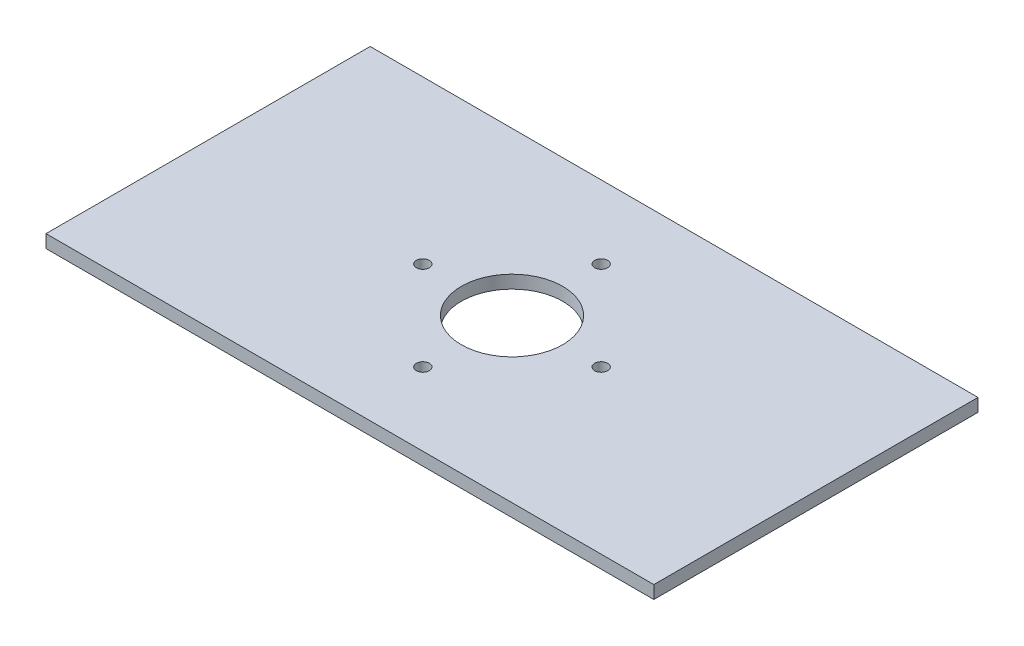
ISO-10303-21;
HEADER;
FILE_DESCRIPTION(('STEP AP214'),'2;1');
FILE_NAME('part.step','',(''),(''),'','','');
FILE_SCHEMA(('AUTOMOTIVE_DESIGN { 1 0 10303 214 1 1 1 1 }'));
ENDSEC;
DATA;
#1=APPLICATION_CONTEXT('core data for automotive mechanical design processes');
#2=APPLICATION_PROTOCOL_DEFINITION('international standard','automotive_design',2000,#1);
#3=PRODUCT_CONTEXT('',#1,'mechanical');
#4=PRODUCT('Part','Part','',(#3));
#5=PRODUCT_RELATED_PRODUCT_CATEGORY('part','',(#4));
#6=PRODUCT_DEFINITION_FORMATION('','',#4);
#7=PRODUCT_DEFINITION_CONTEXT('part definition',#1,'design');
#8=PRODUCT_DEFINITION('design','',#6,#7);
#9=PRODUCT_DEFINITION_SHAPE('','',#8);
#10=(LENGTH_UNIT() NAMED_UNIT(*) SI_UNIT(.MILLI.,.METRE.));
#11=(NAMED_UNIT(*) PLANE_ANGLE_UNIT() SI_UNIT($,.RADIAN.));
#12=(NAMED_UNIT(*) SI_UNIT($,.STERADIAN.) SOLID_ANGLE_UNIT());
#13=UNCERTAINTY_MEASURE_WITH_UNIT(LENGTH_MEASURE(1.E-05),#10,'distance_accuracy_value','');
#14=(GEOMETRIC_REPRESENTATION_CONTEXT(3) GLOBAL_UNCERTAINTY_ASSIGNED_CONTEXT((#13)) GLOBAL_UNIT_ASSIGNED_CONTEXT((#10,
#11,#12)) REPRESENTATION_CONTEXT('',''));
#15=CARTESIAN_POINT('',(0.,0.,0.));
#16=DIRECTION('',(0.,0.,1.));
#17=DIRECTION('',(1.,0.,0.));
#18=AXIS2_PLACEMENT_3D('',#15,#16,#17);
#19=CARTESIAN_POINT('',(-75.,3.2,-40.));
#20=DIRECTION('',(1.,0.,0.));
#21=DIRECTION('',(0.,0.,-1.));
#22=AXIS2_PLACEMENT_3D('',#19,#20,#21);
#23=PLANE('',#22);
#24=DIRECTION('',(0.,0.,1.));
#25=VECTOR('',#24,1.);
#26=CARTESIAN_POINT('',(-75.,0.,-40.));
#27=LINE('',#26,#25);
#28=CARTESIAN_POINT('',(-75.,0.,-40.));
#29=VERTEX_POINT('',#28);
#30=CARTESIAN_POINT('',(-75.,0.,40.));
#31=VERTEX_POINT('',#30);
#32=EDGE_CURVE('E106',#29,#31,#27,.T.);
#33=ORIENTED_EDGE('',*,*,#32,.T.);
#34=DIRECTION('',(0.,-1.,0.));
#35=VECTOR('',#34,1.);
#36=CARTESIAN_POINT('',(-75.,3.2,40.));
#37=LINE('',#36,#35);
#38=CARTESIAN_POINT('',(-75.,3.2,40.));
#39=VERTEX_POINT('',#38);
#40=EDGE_CURVE('E11',#39,#31,#37,.T.);
#41=ORIENTED_EDGE('',*,*,#40,.F.);
#42=DIRECTION('',(0.,0.,1.));
#43=VECTOR('',#42,1.);
#44=CARTESIAN_POINT('',(-75.,3.2,-40.));
#45=LINE('',#44,#43);
#46=CARTESIAN_POINT('',(-75.,3.2,-40.));
#47=VERTEX_POINT('',#46);
#48=EDGE_CURVE('E94',#47,#39,#45,.T.);
#49=ORIENTED_EDGE('',*,*,#48,.F.);
#50=DIRECTION('',(0.,-1.,0.));
#51=VECTOR('',#50,1.);
#52=CARTESIAN_POINT('',(-75.,3.2,-40.));
#53=LINE('',#52,#51);
#54=EDGE_CURVE('E102',#47,#29,#53,.T.);
#55=ORIENTED_EDGE('',*,*,#54,.T.);
#56=EDGE_LOOP('',(#33,#41,#49,#55));
#57=FACE_BOUND('',#56,.T.);
#58=ADVANCED_FACE('F43',(#57),#23,.F.);
#59=CARTESIAN_POINT('',(-75.,3.2,40.));
#60=DIRECTION('',(0.,0.,-1.));
#61=DIRECTION('',(-1.,0.,0.));
#62=AXIS2_PLACEMENT_3D('',#59,#60,#61);
#63=PLANE('',#62);
#64=DIRECTION('',(1.,0.,0.));
#65=VECTOR('',#64,1.);
#66=CARTESIAN_POINT('',(-75.,0.,40.));
#67=LINE('',#66,#65);
#68=CARTESIAN_POINT('',(75.,0.,40.));
#69=VERTEX_POINT('',#68);
#70=EDGE_CURVE('E98',#31,#69,#67,.T.);
#71=ORIENTED_EDGE('',*,*,#70,.T.);
#72=DIRECTION('',(0.,-1.,0.));
#73=VECTOR('',#72,1.);
#74=CARTESIAN_POINT('',(75.,3.2,40.));
#75=LINE('',#74,#73);
#76=CARTESIAN_POINT('',(75.,3.2,40.));
#77=VERTEX_POINT('',#76);
#78=EDGE_CURVE('E51',#77,#69,#75,.T.);
#79=ORIENTED_EDGE('',*,*,#78,.F.);
#80=DIRECTION('',(1.,0.,0.));
#81=VECTOR('',#80,1.);
#82=CARTESIAN_POINT('',(-75.,3.2,40.));
#83=LINE('',#82,#81);
#84=EDGE_CURVE('E89',#39,#77,#83,.T.);
#85=ORIENTED_EDGE('',*,*,#84,.F.);
#86=ORIENTED_EDGE('',*,*,#40,.T.);
#87=EDGE_LOOP('',(#71,#79,#85,#86));
#88=FACE_BOUND('',#87,.T.);
#89=ADVANCED_FACE('F97',(#88),#63,.F.);
#90=CARTESIAN_POINT('',(75.,3.2,-40.));
#91=DIRECTION('',(-1.,0.,0.));
#92=DIRECTION('',(0.,0.,1.));
#93=AXIS2_PLACEMENT_3D('',#90,#91,#92);
#94=PLANE('',#93);
#95=DIRECTION('',(0.,0.,-1.));
#96=VECTOR('',#95,1.);
#97=CARTESIAN_POINT('',(75.,0.,-40.));
#98=LINE('',#97,#96);
#99=CARTESIAN_POINT('',(75.,0.,-40.));
#100=VERTEX_POINT('',#99);
#101=EDGE_CURVE('E76',#69,#100,#98,.T.);
#102=ORIENTED_EDGE('',*,*,#101,.T.);
#103=DIRECTION('',(0.,-1.,0.));
#104=VECTOR('',#103,1.);
#105=CARTESIAN_POINT('',(75.,3.2,-40.));
#106=LINE('',#105,#104);
#107=CARTESIAN_POINT('',(75.,3.2,-40.));
#108=VERTEX_POINT('',#107);
#109=EDGE_CURVE('E99',#108,#100,#106,.T.);
#110=ORIENTED_EDGE('',*,*,#109,.F.);
#111=DIRECTION('',(0.,0.,-1.));
#112=VECTOR('',#111,1.);
#113=CARTESIAN_POINT('',(75.,3.2,-40.));
#114=LINE('',#113,#112);
#115=EDGE_CURVE('E92',#77,#108,#114,.T.);
#116=ORIENTED_EDGE('',*,*,#115,.F.);
#117=ORIENTED_EDGE('',*,*,#78,.T.);
#118=EDGE_LOOP('',(#102,#110,#116,#117));
#119=FACE_BOUND('',#118,.T.);
#120=ADVANCED_FACE('F100',(#119),#94,.F.);
#121=CARTESIAN_POINT('',(-75.,3.2,-40.));
#122=DIRECTION('',(0.,0.,1.));
#123=DIRECTION('',(1.,0.,0.));
#124=AXIS2_PLACEMENT_3D('',#121,#122,#123);
#125=PLANE('',#124);
#126=DIRECTION('',(-1.,0.,0.));
#127=VECTOR('',#126,1.);
#128=CARTESIAN_POINT('',(-75.,0.,-40.));
#129=LINE('',#128,#127);
#130=EDGE_CURVE('E82',#100,#29,#129,.T.);
#131=ORIENTED_EDGE('',*,*,#130,.T.);
#132=ORIENTED_EDGE('',*,*,#54,.F.);
#133=DIRECTION('',(-1.,0.,0.));
#134=VECTOR('',#133,1.);
#135=CARTESIAN_POINT('',(-75.,3.2,-40.));
#136=LINE('',#135,#134);
#137=EDGE_CURVE('E59',#108,#47,#136,.T.);
#138=ORIENTED_EDGE('',*,*,#137,.F.);
#139=ORIENTED_EDGE('',*,*,#109,.T.);
#140=EDGE_LOOP('',(#131,#132,#138,#139));
#141=FACE_BOUND('',#140,.T.);
#142=ADVANCED_FACE('F114',(#141),#125,.F.);
#143=CARTESIAN_POINT('',(0.,3.2,0.));
#144=DIRECTION('',(0.,1.,0.));
#145=DIRECTION('',(0.,0.,1.));
#146=AXIS2_PLACEMENT_3D('',#143,#144,#145);
#147=PLANE('',#146);
#148=CARTESIAN_POINT('',(-22.,3.2,0.));
#149=DIRECTION('',(0.,1.,0.));
#150=DIRECTION('',(0.,0.,1.));
#151=AXIS2_PLACEMENT_3D('',#148,#149,#150);
#152=CIRCLE('',#151,1.60000000000001);
#153=CARTESIAN_POINT('',(-22.,3.2,1.60000000000002));
#154=VERTEX_POINT('',#153);
#155=EDGE_CURVE('E142',#154,#154,#152,.T.);
#156=ORIENTED_EDGE('',*,*,#155,.F.);
#157=EDGE_LOOP('',(#156));
#158=FACE_BOUND('',#157,.T.);
#159=CARTESIAN_POINT('',(0.,3.2,-22.));
#160=DIRECTION('',(0.,1.,0.));
#161=DIRECTION('',(0.,0.,1.));
#162=AXIS2_PLACEMENT_3D('',#159,#160,#161);
#163=CIRCLE('',#162,1.60000000000001);
#164=CARTESIAN_POINT('',(0.,3.2,-20.4));
#165=VERTEX_POINT('',#164);
#166=EDGE_CURVE('E139',#165,#165,#163,.T.);
#167=ORIENTED_EDGE('',*,*,#166,.F.);
#168=EDGE_LOOP('',(#167));
#169=FACE_BOUND('',#168,.T.);
#170=CARTESIAN_POINT('',(22.,3.2,0.));
#171=DIRECTION('',(0.,1.,0.));
#172=DIRECTION('',(0.,0.,1.));
#173=AXIS2_PLACEMENT_3D('',#170,#171,#172);
#174=CIRCLE('',#173,1.60000000000001);
#175=CARTESIAN_POINT('',(22.,3.2,1.60000000000001));
#176=VERTEX_POINT('',#175);
#177=EDGE_CURVE('E133',#176,#176,#174,.T.);
#178=ORIENTED_EDGE('',*,*,#177,.F.);
#179=EDGE_LOOP('',(#178));
#180=FACE_BOUND('',#179,.T.);
#181=CARTESIAN_POINT('',(0.,3.2,22.));
#182=DIRECTION('',(0.,1.,0.));
#183=DIRECTION('',(0.,0.,1.));
#184=AXIS2_PLACEMENT_3D('',#181,#182,#183);
#185=CIRCLE('',#184,1.60000000000001);
#186=CARTESIAN_POINT('',(0.,3.2,23.6));
#187=VERTEX_POINT('',#186);
#188=EDGE_CURVE('E126',#187,#187,#185,.T.);
#189=ORIENTED_EDGE('',*,*,#188,.F.);
#190=EDGE_LOOP('',(#189));
#191=FACE_BOUND('',#190,.T.);
#192=CARTESIAN_POINT('',(0.,3.2,0.));
#193=DIRECTION('',(0.,1.,0.));
#194=DIRECTION('',(0.,0.,1.));
#195=AXIS2_PLACEMENT_3D('',#192,#193,#194);
#196=CIRCLE('',#195,12.5);
#197=CARTESIAN_POINT('',(0.,3.2,12.5));
#198=VERTEX_POINT('',#197);
#199=EDGE_CURVE('E122',#198,#198,#196,.T.);
#200=ORIENTED_EDGE('',*,*,#199,.F.);
#201=EDGE_LOOP('',(#200));
#202=FACE_BOUND('',#201,.T.);
#203=ORIENTED_EDGE('',*,*,#48,.T.);
#204=ORIENTED_EDGE('',*,*,#84,.T.);
#205=ORIENTED_EDGE('',*,*,#115,.T.);
#206=ORIENTED_EDGE('',*,*,#137,.T.);
#207=EDGE_LOOP('',(#203,#204,#205,#206));
#208=FACE_BOUND('',#207,.T.);
#209=ADVANCED_FACE('F90',(#158,#169,#180,#191,#202,#208),#147,.T.);
#210=CARTESIAN_POINT('',(0.,0.,0.));
#211=DIRECTION('',(0.,1.,0.));
#212=DIRECTION('',(0.,0.,1.));
#213=AXIS2_PLACEMENT_3D('',#210,#211,#212);
#214=PLANE('',#213);
#215=CARTESIAN_POINT('',(-22.,0.,0.));
#216=DIRECTION('',(0.,1.,0.));
#217=DIRECTION('',(0.,0.,1.));
#218=AXIS2_PLACEMENT_3D('',#215,#216,#217);
#219=CIRCLE('',#218,1.60000000000001);
#220=CARTESIAN_POINT('',(-22.,0.,1.60000000000002));
#221=VERTEX_POINT('',#220);
#222=EDGE_CURVE('E125',#221,#221,#219,.F.);
#223=ORIENTED_EDGE('',*,*,#222,.F.);
#224=EDGE_LOOP('',(#223));
#225=FACE_BOUND('',#224,.T.);
#226=CARTESIAN_POINT('',(0.,0.,-22.));
#227=DIRECTION('',(0.,1.,0.));
#228=DIRECTION('',(0.,0.,1.));
#229=AXIS2_PLACEMENT_3D('',#226,#227,#228);
#230=CIRCLE('',#229,1.60000000000001);
#231=CARTESIAN_POINT('',(0.,0.,-20.4));
#232=VERTEX_POINT('',#231);
#233=EDGE_CURVE('E136',#232,#232,#230,.F.);
#234=ORIENTED_EDGE('',*,*,#233,.F.);
#235=EDGE_LOOP('',(#234));
#236=FACE_BOUND('',#235,.T.);
#237=CARTESIAN_POINT('',(22.,0.,0.));
#238=DIRECTION('',(0.,1.,0.));
#239=DIRECTION('',(0.,0.,1.));
#240=AXIS2_PLACEMENT_3D('',#237,#238,#239);
#241=CIRCLE('',#240,1.60000000000001);
#242=CARTESIAN_POINT('',(22.,0.,1.60000000000001));
#243=VERTEX_POINT('',#242);
#244=EDGE_CURVE('E129',#243,#243,#241,.F.);
#245=ORIENTED_EDGE('',*,*,#244,.F.);
#246=EDGE_LOOP('',(#245));
#247=FACE_BOUND('',#246,.T.);
#248=CARTESIAN_POINT('',(0.,0.,22.));
#249=DIRECTION('',(0.,1.,0.));
#250=DIRECTION('',(0.,0.,1.));
#251=AXIS2_PLACEMENT_3D('',#248,#249,#250);
#252=CIRCLE('',#251,1.60000000000001);
#253=CARTESIAN_POINT('',(0.,0.,23.6));
#254=VERTEX_POINT('',#253);
#255=EDGE_CURVE('E130',#254,#254,#252,.F.);
#256=ORIENTED_EDGE('',*,*,#255,.F.);
#257=EDGE_LOOP('',(#256));
#258=FACE_BOUND('',#257,.T.);
#259=CARTESIAN_POINT('',(0.,0.,0.));
#260=DIRECTION('',(0.,1.,0.));
#261=DIRECTION('',(0.,0.,1.));
#262=AXIS2_PLACEMENT_3D('',#259,#260,#261);
#263=CIRCLE('',#262,12.5);
#264=CARTESIAN_POINT('',(0.,0.,12.5));
#265=VERTEX_POINT('',#264);
#266=EDGE_CURVE('E109',#265,#265,#263,.F.);
#267=ORIENTED_EDGE('',*,*,#266,.F.);
#268=EDGE_LOOP('',(#267));
#269=FACE_BOUND('',#268,.T.);
#270=ORIENTED_EDGE('',*,*,#32,.F.);
#271=ORIENTED_EDGE('',*,*,#130,.F.);
#272=ORIENTED_EDGE('',*,*,#101,.F.);
#273=ORIENTED_EDGE('',*,*,#70,.F.);
#274=EDGE_LOOP('',(#270,#271,#272,#273));
#275=FACE_BOUND('',#274,.T.);
#276=ADVANCED_FACE('F117',(#225,#236,#247,#258,#269,#275),#214,.F.);
#277=CARTESIAN_POINT('',(0.,-35.3553390593274,0.));
#278=DIRECTION('',(0.,1.,0.));
#279=DIRECTION('',(0.,0.,1.));
#280=AXIS2_PLACEMENT_3D('',#277,#278,#279);
#281=CYLINDRICAL_SURFACE('',#280,12.5);
#282=ORIENTED_EDGE('',*,*,#266,.T.);
#283=EDGE_LOOP('',(#282));
#284=FACE_BOUND('',#283,.T.);
#285=ORIENTED_EDGE('',*,*,#199,.T.);
#286=EDGE_LOOP('',(#285));
#287=FACE_BOUND('',#286,.T.);
#288=ADVANCED_FACE('F163',(#284,#287),#281,.F.);
#289=CARTESIAN_POINT('',(0.,-4.52548339959394,22.));
#290=DIRECTION('',(0.,1.,0.));
#291=DIRECTION('',(0.,0.,1.));
#292=AXIS2_PLACEMENT_3D('',#289,#290,#291);
#293=CYLINDRICAL_SURFACE('',#292,1.60000000000001);
#294=ORIENTED_EDGE('',*,*,#255,.T.);
#295=EDGE_LOOP('',(#294));
#296=FACE_BOUND('',#295,.T.);
#297=ORIENTED_EDGE('',*,*,#188,.T.);
#298=EDGE_LOOP('',(#297));
#299=FACE_BOUND('',#298,.T.);
#300=ADVANCED_FACE('F165',(#296,#299),#293,.F.);
#301=CARTESIAN_POINT('',(22.,-4.52548339959394,0.));
#302=DIRECTION('',(0.,1.,0.));
#303=DIRECTION('',(0.,0.,1.));
#304=AXIS2_PLACEMENT_3D('',#301,#302,#303);
#305=CYLINDRICAL_SURFACE('',#304,1.60000000000001);
#306=ORIENTED_EDGE('',*,*,#244,.T.);
#307=EDGE_LOOP('',(#306));
#308=FACE_BOUND('',#307,.T.);
#309=ORIENTED_EDGE('',*,*,#177,.T.);
#310=EDGE_LOOP('',(#309));
#311=FACE_BOUND('',#310,.T.);
#312=ADVANCED_FACE('F172',(#308,#311),#305,.F.);
#313=CARTESIAN_POINT('',(0.,-4.52548339959394,-22.));
#314=DIRECTION('',(0.,1.,0.));
#315=DIRECTION('',(0.,0.,1.));
#316=AXIS2_PLACEMENT_3D('',#313,#314,#315);
#317=CYLINDRICAL_SURFACE('',#316,1.60000000000001);
#318=ORIENTED_EDGE('',*,*,#233,.T.);
#319=EDGE_LOOP('',(#318));
#320=FACE_BOUND('',#319,.T.);
#321=ORIENTED_EDGE('',*,*,#166,.T.);
#322=EDGE_LOOP('',(#321));
#323=FACE_BOUND('',#322,.T.);
#324=ADVANCED_FACE('F231',(#320,#323),#317,.F.);
#325=CARTESIAN_POINT('',(-22.,-4.52548339959394,0.));
#326=DIRECTION('',(0.,1.,0.));
#327=DIRECTION('',(0.,0.,1.));
#328=AXIS2_PLACEMENT_3D('',#325,#326,#327);
#329=CYLINDRICAL_SURFACE('',#328,1.60000000000001);
#330=ORIENTED_EDGE('',*,*,#222,.T.);
#331=EDGE_LOOP('',(#330));
#332=FACE_BOUND('',#331,.T.);
#333=ORIENTED_EDGE('',*,*,#155,.T.);
#334=EDGE_LOOP('',(#333));
#335=FACE_BOUND('',#334,.T.);
#336=ADVANCED_FACE('F150',(#332,#335),#329,.F.);
#337=CLOSED_SHELL('',(#58,#89,#120,#142,#209,#276,#288,#300,#312,#324,#336));
#338=MANIFOLD_SOLID_BREP('B2',#337);
#339=ADVANCED_BREP_SHAPE_REPRESENTATION('',(#18,#338),#14);
#340=SHAPE_DEFINITION_REPRESENTATION(#9,#339);
ENDSEC;
END-ISO-10303-21;
